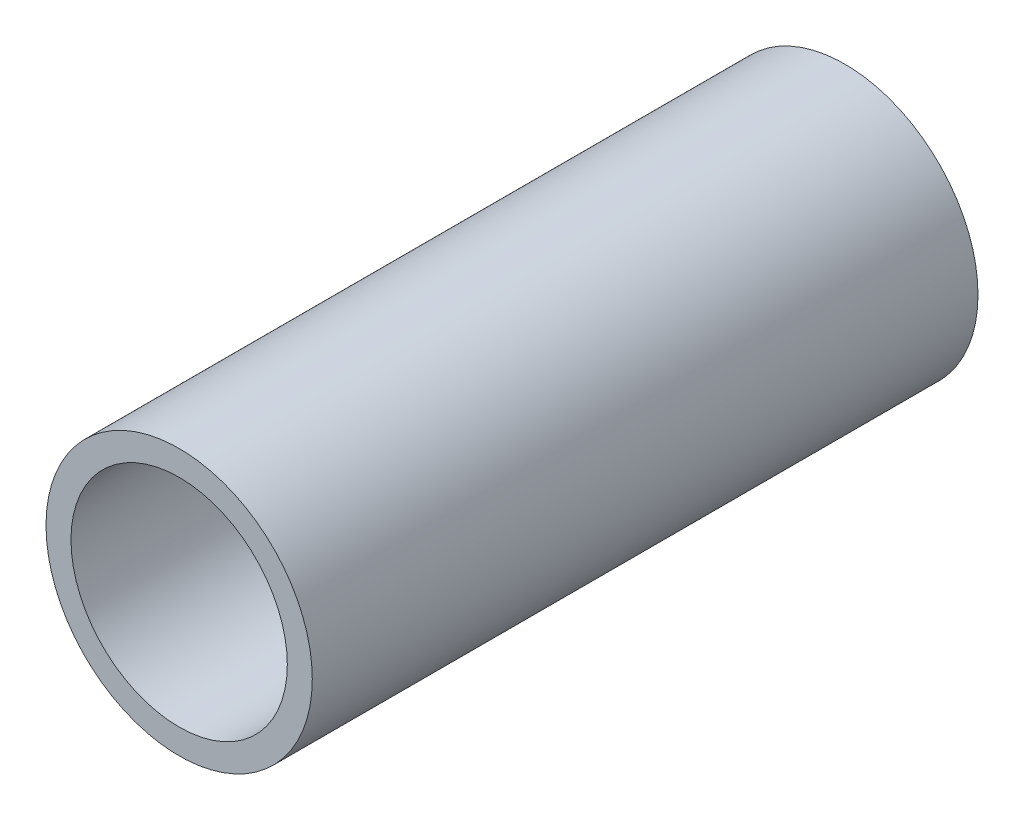
ISO-10303-21;
HEADER;
FILE_DESCRIPTION(('STEP AP214'),'2;1');
FILE_NAME('part.step','',(''),(''),'','','');
FILE_SCHEMA(('AUTOMOTIVE_DESIGN { 1 0 10303 214 1 1 1 1 }'));
ENDSEC;
DATA;
#1=APPLICATION_CONTEXT('core data for automotive mechanical design processes');
#2=APPLICATION_PROTOCOL_DEFINITION('international standard','automotive_design',2000,#1);
#3=PRODUCT_CONTEXT('',#1,'mechanical');
#4=PRODUCT('Part','Part','',(#3));
#5=PRODUCT_RELATED_PRODUCT_CATEGORY('part','',(#4));
#6=PRODUCT_DEFINITION_FORMATION('','',#4);
#7=PRODUCT_DEFINITION_CONTEXT('part definition',#1,'design');
#8=PRODUCT_DEFINITION('design','',#6,#7);
#9=PRODUCT_DEFINITION_SHAPE('','',#8);
#10=(LENGTH_UNIT() NAMED_UNIT(*) SI_UNIT(.MILLI.,.METRE.));
#11=(NAMED_UNIT(*) PLANE_ANGLE_UNIT() SI_UNIT($,.RADIAN.));
#12=(NAMED_UNIT(*) SI_UNIT($,.STERADIAN.) SOLID_ANGLE_UNIT());
#13=UNCERTAINTY_MEASURE_WITH_UNIT(LENGTH_MEASURE(1.E-05),#10,'distance_accuracy_value','');
#14=(GEOMETRIC_REPRESENTATION_CONTEXT(3) GLOBAL_UNCERTAINTY_ASSIGNED_CONTEXT((#13)) GLOBAL_UNIT_ASSIGNED_CONTEXT((#10,
#11,#12)) REPRESENTATION_CONTEXT('',''));
#15=CARTESIAN_POINT('',(0.,0.,0.));
#16=DIRECTION('',(0.,0.,1.));
#17=DIRECTION('',(1.,0.,0.));
#18=AXIS2_PLACEMENT_3D('',#15,#16,#17);
#19=CARTESIAN_POINT('',(0.,0.,40.));
#20=DIRECTION('',(0.,0.,1.));
#21=DIRECTION('',(1.,0.,0.));
#22=AXIS2_PLACEMENT_3D('',#19,#20,#21);
#23=PLANE('',#22);
#24=CARTESIAN_POINT('',(0.,0.,40.));
#25=DIRECTION('',(0.,0.,1.));
#26=DIRECTION('',(1.,0.,0.));
#27=AXIS2_PLACEMENT_3D('',#24,#25,#26);
#28=CIRCLE('',#27,8.);
#29=CARTESIAN_POINT('',(8.,0.,40.));
#30=VERTEX_POINT('',#29);
#31=EDGE_CURVE('E10',#30,#30,#28,.T.);
#32=ORIENTED_EDGE('',*,*,#31,.T.);
#33=EDGE_LOOP('',(#32));
#34=FACE_BOUND('',#33,.T.);
#35=CARTESIAN_POINT('',(0.,0.,40.));
#36=DIRECTION('',(0.,0.,1.));
#37=DIRECTION('',(1.,0.,0.));
#38=AXIS2_PLACEMENT_3D('',#35,#36,#37);
#39=CIRCLE('',#38,6.5);
#40=CARTESIAN_POINT('',(6.5,0.,40.));
#41=VERTEX_POINT('',#40);
#42=EDGE_CURVE('E42',#41,#41,#39,.T.);
#43=ORIENTED_EDGE('',*,*,#42,.F.);
#44=EDGE_LOOP('',(#43));
#45=FACE_BOUND('',#44,.T.);
#46=ADVANCED_FACE('F31',(#34,#45),#23,.T.);
#47=CARTESIAN_POINT('',(0.,0.,0.));
#48=DIRECTION('',(0.,0.,1.));
#49=DIRECTION('',(1.,0.,0.));
#50=AXIS2_PLACEMENT_3D('',#47,#48,#49);
#51=PLANE('',#50);
#52=CARTESIAN_POINT('',(0.,0.,0.));
#53=DIRECTION('',(0.,0.,1.));
#54=DIRECTION('',(1.,0.,0.));
#55=AXIS2_PLACEMENT_3D('',#52,#53,#54);
#56=CIRCLE('',#55,8.);
#57=CARTESIAN_POINT('',(8.,0.,0.));
#58=VERTEX_POINT('',#57);
#59=EDGE_CURVE('E35',#58,#58,#56,.T.);
#60=ORIENTED_EDGE('',*,*,#59,.F.);
#61=EDGE_LOOP('',(#60));
#62=FACE_BOUND('',#61,.T.);
#63=CARTESIAN_POINT('',(0.,0.,0.));
#64=DIRECTION('',(0.,0.,1.));
#65=DIRECTION('',(1.,0.,0.));
#66=AXIS2_PLACEMENT_3D('',#63,#64,#65);
#67=CIRCLE('',#66,6.5);
#68=CARTESIAN_POINT('',(6.5,0.,0.));
#69=VERTEX_POINT('',#68);
#70=EDGE_CURVE('E44',#69,#69,#67,.T.);
#71=ORIENTED_EDGE('',*,*,#70,.T.);
#72=EDGE_LOOP('',(#71));
#73=FACE_BOUND('',#72,.T.);
#74=ADVANCED_FACE('F54',(#62,#73),#51,.F.);
#75=CARTESIAN_POINT('',(0.,0.,40.));
#76=DIRECTION('',(0.,0.,-1.));
#77=DIRECTION('',(-1.,0.,0.));
#78=AXIS2_PLACEMENT_3D('',#75,#76,#77);
#79=CYLINDRICAL_SURFACE('',#78,8.);
#80=ORIENTED_EDGE('',*,*,#31,.F.);
#81=EDGE_LOOP('',(#80));
#82=FACE_BOUND('',#81,.T.);
#83=ORIENTED_EDGE('',*,*,#59,.T.);
#84=EDGE_LOOP('',(#83));
#85=FACE_BOUND('',#84,.T.);
#86=ADVANCED_FACE('F33',(#82,#85),#79,.T.);
#87=CARTESIAN_POINT('',(0.,0.,40.));
#88=DIRECTION('',(0.,0.,-1.));
#89=DIRECTION('',(-1.,0.,0.));
#90=AXIS2_PLACEMENT_3D('',#87,#88,#89);
#91=CYLINDRICAL_SURFACE('',#90,6.5);
#92=ORIENTED_EDGE('',*,*,#42,.T.);
#93=EDGE_LOOP('',(#92));
#94=FACE_BOUND('',#93,.T.);
#95=ORIENTED_EDGE('',*,*,#70,.F.);
#96=EDGE_LOOP('',(#95));
#97=FACE_BOUND('',#96,.T.);
#98=ADVANCED_FACE('F50',(#94,#97),#91,.F.);
#99=CLOSED_SHELL('',(#46,#74,#86,#98));
#100=MANIFOLD_SOLID_BREP('B2',#99);
#101=ADVANCED_BREP_SHAPE_REPRESENTATION('',(#18,#100),#14);
#102=SHAPE_DEFINITION_REPRESENTATION(#9,#101);
ENDSEC;
END-ISO-10303-21;
